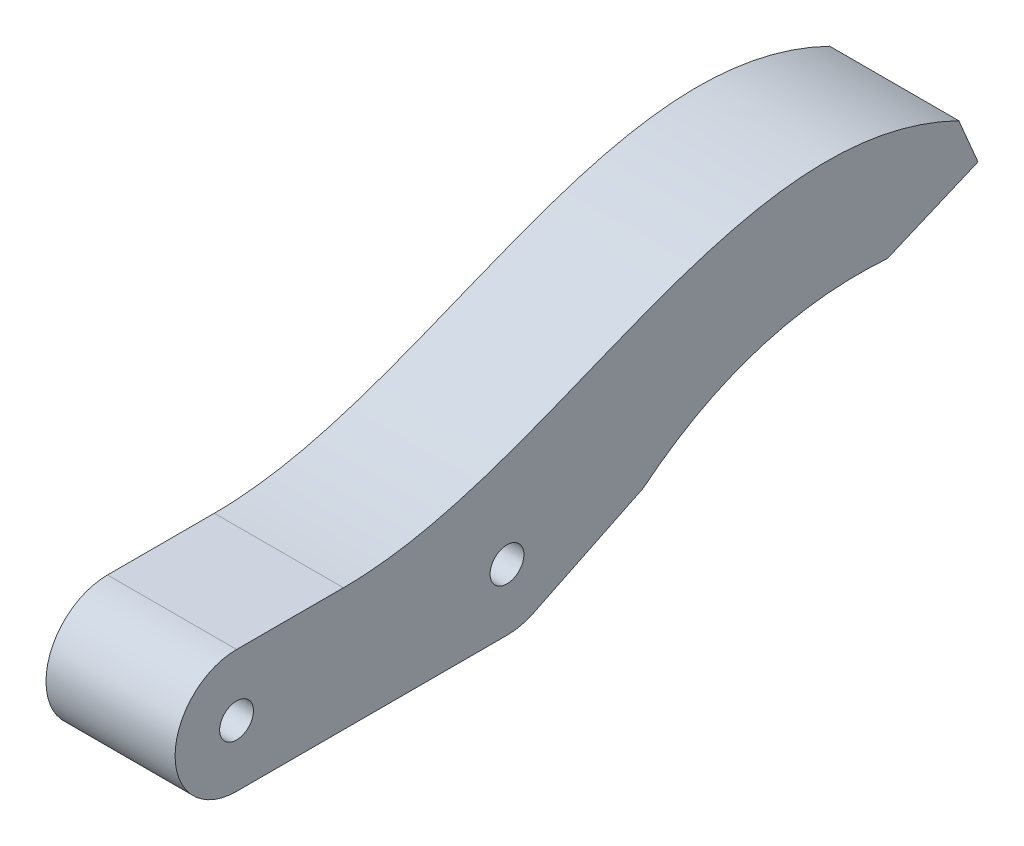
ISO-10303-21;
HEADER;
FILE_DESCRIPTION(('STEP AP214'),'2;1');
FILE_NAME('part.step','',(''),(''),'','','');
FILE_SCHEMA(('AUTOMOTIVE_DESIGN { 1 0 10303 214 1 1 1 1 }'));
ENDSEC;
DATA;
#1=APPLICATION_CONTEXT('core data for automotive mechanical design processes');
#2=APPLICATION_PROTOCOL_DEFINITION('international standard','automotive_design',2000,#1);
#3=PRODUCT_CONTEXT('',#1,'mechanical');
#4=PRODUCT('Part','Part','',(#3));
#5=PRODUCT_RELATED_PRODUCT_CATEGORY('part','',(#4));
#6=PRODUCT_DEFINITION_FORMATION('','',#4);
#7=PRODUCT_DEFINITION_CONTEXT('part definition',#1,'design');
#8=PRODUCT_DEFINITION('design','',#6,#7);
#9=PRODUCT_DEFINITION_SHAPE('','',#8);
#10=(LENGTH_UNIT() NAMED_UNIT(*) SI_UNIT(.MILLI.,.METRE.));
#11=(NAMED_UNIT(*) PLANE_ANGLE_UNIT() SI_UNIT($,.RADIAN.));
#12=(NAMED_UNIT(*) SI_UNIT($,.STERADIAN.) SOLID_ANGLE_UNIT());
#13=UNCERTAINTY_MEASURE_WITH_UNIT(LENGTH_MEASURE(1.E-05),#10,'distance_accuracy_value','');
#14=(GEOMETRIC_REPRESENTATION_CONTEXT(3) GLOBAL_UNCERTAINTY_ASSIGNED_CONTEXT((#13)) GLOBAL_UNIT_ASSIGNED_CONTEXT((#10,
#11,#12)) REPRESENTATION_CONTEXT('',''));
#15=CARTESIAN_POINT('',(0.,0.,0.));
#16=DIRECTION('',(0.,0.,1.));
#17=DIRECTION('',(1.,0.,0.));
#18=AXIS2_PLACEMENT_3D('',#15,#16,#17);
#19=CARTESIAN_POINT('',(10.5,5.,-27.));
#20=DIRECTION('',(-1.,0.,0.));
#21=DIRECTION('',(0.,0.,1.));
#22=AXIS2_PLACEMENT_3D('',#19,#20,#21);
#23=CYLINDRICAL_SURFACE('',#22,5.);
#24=DIRECTION('',(1.,0.,0.));
#25=VECTOR('',#24,1.);
#26=CARTESIAN_POINT('',(-56.0007840593189,0.502127655445501,-29.1838370754458));
#27=LINE('',#26,#25);
#28=CARTESIAN_POINT('',(0.,0.502127655445501,-29.1838370754458));
#29=VERTEX_POINT('',#28);
#30=CARTESIAN_POINT('',(10.5,0.502127655445501,-29.1838370754458));
#31=VERTEX_POINT('',#30);
#32=EDGE_CURVE('E188',#29,#31,#27,.T.);
#33=ORIENTED_EDGE('',*,*,#32,.T.);
#34=CARTESIAN_POINT('',(10.5,5.,-27.));
#35=DIRECTION('',(1.,0.,0.));
#36=DIRECTION('',(0.,0.,-1.));
#37=AXIS2_PLACEMENT_3D('',#34,#35,#36);
#38=CIRCLE('',#37,5.);
#39=CARTESIAN_POINT('',(10.5,0.,-27.));
#40=VERTEX_POINT('',#39);
#41=EDGE_CURVE('E205',#40,#31,#38,.T.);
#42=ORIENTED_EDGE('',*,*,#41,.F.);
#43=DIRECTION('',(-1.,0.,0.));
#44=VECTOR('',#43,1.);
#45=CARTESIAN_POINT('',(10.5,0.,-27.));
#46=LINE('',#45,#44);
#47=CARTESIAN_POINT('',(0.,0.,-27.));
#48=VERTEX_POINT('',#47);
#49=EDGE_CURVE('E208',#40,#48,#46,.T.);
#50=ORIENTED_EDGE('',*,*,#49,.T.);
#51=CARTESIAN_POINT('',(0.,5.,-27.));
#52=DIRECTION('',(1.,0.,0.));
#53=DIRECTION('',(0.,0.,-1.));
#54=AXIS2_PLACEMENT_3D('',#51,#52,#53);
#55=CIRCLE('',#54,5.);
#56=EDGE_CURVE('E75',#48,#29,#55,.T.);
#57=ORIENTED_EDGE('',*,*,#56,.T.);
#58=EDGE_LOOP('',(#33,#42,#50,#57));
#59=FACE_BOUND('',#58,.T.);
#60=ADVANCED_FACE('F60',(#59),#23,.T.);
#61=CARTESIAN_POINT('',(10.5,5.,-5.));
#62=DIRECTION('',(-1.,0.,0.));
#63=DIRECTION('',(0.,0.,1.));
#64=AXIS2_PLACEMENT_3D('',#61,#62,#63);
#65=CYLINDRICAL_SURFACE('',#64,5.);
#66=CARTESIAN_POINT('',(0.,5.,-5.));
#67=DIRECTION('',(1.,0.,0.));
#68=DIRECTION('',(0.,0.,-1.));
#69=AXIS2_PLACEMENT_3D('',#66,#67,#68);
#70=CIRCLE('',#69,5.);
#71=CARTESIAN_POINT('',(0.,10.,-5.));
#72=VERTEX_POINT('',#71);
#73=CARTESIAN_POINT('',(0.,0.,-5.));
#74=VERTEX_POINT('',#73);
#75=EDGE_CURVE('E210',#72,#74,#70,.T.);
#76=ORIENTED_EDGE('',*,*,#75,.T.);
#77=DIRECTION('',(-1.,0.,0.));
#78=VECTOR('',#77,1.);
#79=CARTESIAN_POINT('',(10.5,0.,-5.));
#80=LINE('',#79,#78);
#81=CARTESIAN_POINT('',(10.5,0.,-5.));
#82=VERTEX_POINT('',#81);
#83=EDGE_CURVE('E68',#82,#74,#80,.T.);
#84=ORIENTED_EDGE('',*,*,#83,.F.);
#85=CARTESIAN_POINT('',(10.5,5.,-5.));
#86=DIRECTION('',(1.,0.,0.));
#87=DIRECTION('',(0.,0.,-1.));
#88=AXIS2_PLACEMENT_3D('',#85,#86,#87);
#89=CIRCLE('',#88,5.);
#90=CARTESIAN_POINT('',(10.5,10.,-5.));
#91=VERTEX_POINT('',#90);
#92=EDGE_CURVE('E201',#91,#82,#89,.T.);
#93=ORIENTED_EDGE('',*,*,#92,.F.);
#94=DIRECTION('',(-1.,0.,0.));
#95=VECTOR('',#94,1.);
#96=CARTESIAN_POINT('',(10.5,10.,-5.));
#97=LINE('',#96,#95);
#98=EDGE_CURVE('E12',#91,#72,#97,.T.);
#99=ORIENTED_EDGE('',*,*,#98,.T.);
#100=EDGE_LOOP('',(#76,#84,#93,#99));
#101=FACE_BOUND('',#100,.T.);
#102=ADVANCED_FACE('F237',(#101),#65,.T.);
#103=CARTESIAN_POINT('',(10.5,0.,0.));
#104=DIRECTION('',(0.,1.,0.));
#105=DIRECTION('',(0.,0.,1.));
#106=AXIS2_PLACEMENT_3D('',#103,#104,#105);
#107=PLANE('',#106);
#108=DIRECTION('',(0.,0.,-1.));
#109=VECTOR('',#108,1.);
#110=CARTESIAN_POINT('',(0.,0.,0.));
#111=LINE('',#110,#109);
#112=EDGE_CURVE('E212',#74,#48,#111,.T.);
#113=ORIENTED_EDGE('',*,*,#112,.T.);
#114=ORIENTED_EDGE('',*,*,#49,.F.);
#115=DIRECTION('',(0.,0.,-1.));
#116=VECTOR('',#115,1.);
#117=CARTESIAN_POINT('',(10.5,0.,0.));
#118=LINE('',#117,#116);
#119=EDGE_CURVE('E203',#82,#40,#118,.T.);
#120=ORIENTED_EDGE('',*,*,#119,.F.);
#121=ORIENTED_EDGE('',*,*,#83,.T.);
#122=EDGE_LOOP('',(#113,#114,#120,#121));
#123=FACE_BOUND('',#122,.T.);
#124=ADVANCED_FACE('F220',(#123),#107,.F.);
#125=CARTESIAN_POINT('',(10.5,10.,0.));
#126=DIRECTION('',(0.,1.,0.));
#127=DIRECTION('',(0.,0.,1.));
#128=AXIS2_PLACEMENT_3D('',#125,#126,#127);
#129=PLANE('',#128);
#130=DIRECTION('',(1.,0.,0.));
#131=VECTOR('',#130,1.);
#132=CARTESIAN_POINT('',(-56.0007840593189,10.,-13.6949747586838));
#133=LINE('',#132,#131);
#134=CARTESIAN_POINT('',(0.,10.,-13.6949747586838));
#135=VERTEX_POINT('',#134);
#136=CARTESIAN_POINT('',(10.5,10.,-13.6949747586838));
#137=VERTEX_POINT('',#136);
#138=EDGE_CURVE('E83',#135,#137,#133,.T.);
#139=ORIENTED_EDGE('',*,*,#138,.F.);
#140=DIRECTION('',(0.,0.,-1.));
#141=VECTOR('',#140,1.);
#142=CARTESIAN_POINT('',(0.,10.,0.));
#143=LINE('',#142,#141);
#144=EDGE_CURVE('E195',#72,#135,#143,.T.);
#145=ORIENTED_EDGE('',*,*,#144,.F.);
#146=ORIENTED_EDGE('',*,*,#98,.F.);
#147=DIRECTION('',(0.,0.,-1.));
#148=VECTOR('',#147,1.);
#149=CARTESIAN_POINT('',(10.5,10.,0.));
#150=LINE('',#149,#148);
#151=EDGE_CURVE('E196',#91,#137,#150,.T.);
#152=ORIENTED_EDGE('',*,*,#151,.T.);
#153=EDGE_LOOP('',(#139,#145,#146,#152));
#154=FACE_BOUND('',#153,.T.);
#155=ADVANCED_FACE('F62',(#154),#129,.T.);
#156=CARTESIAN_POINT('',(0.,0.,0.));
#157=DIRECTION('',(1.,0.,0.));
#158=DIRECTION('',(0.,0.,-1.));
#159=AXIS2_PLACEMENT_3D('',#156,#157,#158);
#160=PLANE('',#159);
#161=CARTESIAN_POINT('',(0.,5.,-27.));
#162=DIRECTION('',(1.,0.,0.));
#163=DIRECTION('',(0.,0.,-1.));
#164=AXIS2_PLACEMENT_3D('',#161,#162,#163);
#165=CIRCLE('',#164,1.375);
#166=CARTESIAN_POINT('',(0.,5.,-28.375));
#167=VERTEX_POINT('',#166);
#168=EDGE_CURVE('E155',#167,#167,#165,.T.);
#169=ORIENTED_EDGE('',*,*,#168,.T.);
#170=EDGE_LOOP('',(#169));
#171=FACE_BOUND('',#170,.T.);
#172=CARTESIAN_POINT('',(0.,5.,-5.));
#173=DIRECTION('',(1.,0.,0.));
#174=DIRECTION('',(0.,0.,-1.));
#175=AXIS2_PLACEMENT_3D('',#172,#173,#174);
#176=CIRCLE('',#175,1.375);
#177=CARTESIAN_POINT('',(0.,5.,-6.375));
#178=VERTEX_POINT('',#177);
#179=EDGE_CURVE('E366',#178,#178,#176,.T.);
#180=ORIENTED_EDGE('',*,*,#179,.T.);
#181=EDGE_LOOP('',(#180));
#182=FACE_BOUND('',#181,.T.);
#183=DIRECTION('',(0.,-0.436767415089167,0.8995744689109));
#184=VECTOR('',#183,1.);
#185=CARTESIAN_POINT('',(0.,-11.0601312365663,-5.36998891997289));
#186=LINE('',#185,#184);
#187=CARTESIAN_POINT('',(0.,4.82408407678908,-38.0854206599091));
#188=VERTEX_POINT('',#187);
#189=EDGE_CURVE('E183',#188,#29,#186,.T.);
#190=ORIENTED_EDGE('',*,*,#189,.T.);
#191=ORIENTED_EDGE('',*,*,#56,.F.);
#192=ORIENTED_EDGE('',*,*,#112,.F.);
#193=ORIENTED_EDGE('',*,*,#75,.F.);
#194=ORIENTED_EDGE('',*,*,#144,.T.);
#195=CARTESIAN_POINT('',(0.,17.8724231173908,-63.7529722863132));
#196=CARTESIAN_POINT('',(0.,26.563787962677,-45.9288826779558));
#197=CARTESIAN_POINT('',(0.,10.,-31.059268620705));
#198=CARTESIAN_POINT('',(0.,10.,-13.6949747586838));
#199=B_SPLINE_CURVE_WITH_KNOTS('',3,(#195,#196,#197,#198),.UNSPECIFIED.,.F.,.F.,(4,4),(0.,1.),.UNSPECIFIED.);
#200=CARTESIAN_POINT('',(0.,17.8724231173908,-63.7529722863132));
#201=VERTEX_POINT('',#200);
#202=EDGE_CURVE('E191',#135,#201,#199,.F.);
#203=ORIENTED_EDGE('',*,*,#202,.T.);
#204=DIRECTION('',(0.,-0.920726160293631,-0.39020935118337));
#205=VECTOR('',#204,1.);
#206=CARTESIAN_POINT('',(0.,25.6262249672031,-60.4668638650484));
#207=LINE('',#206,#205);
#208=CARTESIAN_POINT('',(0.,14.1895184762162,-65.3138096910467));
#209=VERTEX_POINT('',#208);
#210=EDGE_CURVE('E140',#201,#209,#207,.T.);
#211=ORIENTED_EDGE('',*,*,#210,.T.);
#212=DIRECTION('',(0.,-0.39020935118337,0.920726160293631));
#213=VECTOR('',#212,1.);
#214=CARTESIAN_POINT('',(0.,-11.4367064909869,-4.84694582599828));
#215=LINE('',#214,#213);
#216=CARTESIAN_POINT('',(0.,11.0678436667493,-57.9480004086976));
#217=VERTEX_POINT('',#216);
#218=EDGE_CURVE('E239',#209,#217,#215,.T.);
#219=ORIENTED_EDGE('',*,*,#218,.T.);
#220=CARTESIAN_POINT('',(0.,4.82408407678908,-38.0854206599091));
#221=CARTESIAN_POINT('',(0.,11.8952224566425,-46.7975095094647));
#222=CARTESIAN_POINT('',(0.,11.0678436667493,-57.9480004086976));
#223=B_SPLINE_CURVE_WITH_KNOTS('',2,(#220,#221,#222),.UNSPECIFIED.,.F.,.F.,(3,3),(0.,1.),.UNSPECIFIED.);
#224=EDGE_CURVE('E230',#217,#188,#223,.F.);
#225=ORIENTED_EDGE('',*,*,#224,.T.);
#226=EDGE_LOOP('',(#190,#191,#192,#193,#194,#203,#211,#219,#225));
#227=FACE_BOUND('',#226,.T.);
#228=ADVANCED_FACE('F226',(#171,#182,#227),#160,.F.);
#229=CARTESIAN_POINT('',(10.5,0.,0.));
#230=DIRECTION('',(1.,0.,0.));
#231=DIRECTION('',(0.,0.,-1.));
#232=AXIS2_PLACEMENT_3D('',#229,#230,#231);
#233=PLANE('',#232);
#234=CARTESIAN_POINT('',(10.5,5.,-27.));
#235=DIRECTION('',(1.,0.,0.));
#236=DIRECTION('',(0.,0.,-1.));
#237=AXIS2_PLACEMENT_3D('',#234,#235,#236);
#238=CIRCLE('',#237,1.375);
#239=CARTESIAN_POINT('',(10.5,5.,-28.375));
#240=VERTEX_POINT('',#239);
#241=EDGE_CURVE('E158',#240,#240,#238,.T.);
#242=ORIENTED_EDGE('',*,*,#241,.F.);
#243=EDGE_LOOP('',(#242));
#244=FACE_BOUND('',#243,.T.);
#245=CARTESIAN_POINT('',(10.5,5.,-5.));
#246=DIRECTION('',(1.,0.,0.));
#247=DIRECTION('',(0.,0.,-1.));
#248=AXIS2_PLACEMENT_3D('',#245,#246,#247);
#249=CIRCLE('',#248,1.375);
#250=CARTESIAN_POINT('',(10.5,5.,-6.375));
#251=VERTEX_POINT('',#250);
#252=EDGE_CURVE('E363',#251,#251,#249,.T.);
#253=ORIENTED_EDGE('',*,*,#252,.F.);
#254=EDGE_LOOP('',(#253));
#255=FACE_BOUND('',#254,.T.);
#256=ORIENTED_EDGE('',*,*,#151,.F.);
#257=ORIENTED_EDGE('',*,*,#92,.T.);
#258=ORIENTED_EDGE('',*,*,#119,.T.);
#259=ORIENTED_EDGE('',*,*,#41,.T.);
#260=DIRECTION('',(0.,0.436767415089167,-0.8995744689109));
#261=VECTOR('',#260,1.);
#262=CARTESIAN_POINT('',(10.5,-11.0601312365663,-5.36998891997289));
#263=LINE('',#262,#261);
#264=CARTESIAN_POINT('',(10.5,4.82408407678908,-38.0854206599091));
#265=VERTEX_POINT('',#264);
#266=EDGE_CURVE('E150',#31,#265,#263,.T.);
#267=ORIENTED_EDGE('',*,*,#266,.T.);
#268=CARTESIAN_POINT('',(10.5,4.82408407678908,-38.0854206599091));
#269=CARTESIAN_POINT('',(10.5,11.8952224566425,-46.7975095094647));
#270=CARTESIAN_POINT('',(10.5,11.0678436667493,-57.9480004086976));
#271=B_SPLINE_CURVE_WITH_KNOTS('',2,(#268,#269,#270),.UNSPECIFIED.,.F.,.F.,(3,3),(0.,1.),.UNSPECIFIED.);
#272=CARTESIAN_POINT('',(10.5,11.0678436667493,-57.9480004086976));
#273=VERTEX_POINT('',#272);
#274=EDGE_CURVE('E173',#265,#273,#271,.T.);
#275=ORIENTED_EDGE('',*,*,#274,.T.);
#276=DIRECTION('',(0.,0.39020935118337,-0.920726160293631));
#277=VECTOR('',#276,1.);
#278=CARTESIAN_POINT('',(10.5,-11.4367064909869,-4.84694582599828));
#279=LINE('',#278,#277);
#280=CARTESIAN_POINT('',(10.5,14.1895184762162,-65.3138096910467));
#281=VERTEX_POINT('',#280);
#282=EDGE_CURVE('E143',#273,#281,#279,.T.);
#283=ORIENTED_EDGE('',*,*,#282,.T.);
#284=DIRECTION('',(0.,0.920726160293631,0.39020935118337));
#285=VECTOR('',#284,1.);
#286=CARTESIAN_POINT('',(10.5,25.6262249672031,-60.4668638650484));
#287=LINE('',#286,#285);
#288=CARTESIAN_POINT('',(10.5,17.8724231173908,-63.7529722863132));
#289=VERTEX_POINT('',#288);
#290=EDGE_CURVE('E138',#281,#289,#287,.T.);
#291=ORIENTED_EDGE('',*,*,#290,.T.);
#292=CARTESIAN_POINT('',(10.5,17.8724231173908,-63.7529722863132));
#293=CARTESIAN_POINT('',(10.5,26.563787962677,-45.9288826779558));
#294=CARTESIAN_POINT('',(10.5,10.,-31.059268620705));
#295=CARTESIAN_POINT('',(10.5,10.,-13.6949747586838));
#296=B_SPLINE_CURVE_WITH_KNOTS('',3,(#292,#293,#294,#295),.UNSPECIFIED.,.F.,.F.,(4,4),(0.,1.),.UNSPECIFIED.);
#297=EDGE_CURVE('E146',#289,#137,#296,.T.);
#298=ORIENTED_EDGE('',*,*,#297,.T.);
#299=EDGE_LOOP('',(#256,#257,#258,#259,#267,#275,#283,#291,#298));
#300=FACE_BOUND('',#299,.T.);
#301=ADVANCED_FACE('F152',(#244,#255,#300),#233,.T.);
#302=CARTESIAN_POINT('',(-56.0007840593189,25.6262249672031,-60.4668638650484));
#303=DIRECTION('',(0.,0.39020935118337,-0.920726160293632));
#304=DIRECTION('',(0.,0.920726160293631,0.39020935118337));
#305=AXIS2_PLACEMENT_3D('',#302,#303,#304);
#306=PLANE('',#305);
#307=ORIENTED_EDGE('',*,*,#210,.F.);
#308=DIRECTION('',(1.,0.,0.));
#309=VECTOR('',#308,1.);
#310=CARTESIAN_POINT('',(-56.0007840593189,17.8724231173908,-63.7529722863132));
#311=LINE('',#310,#309);
#312=EDGE_CURVE('E133',#201,#289,#311,.T.);
#313=ORIENTED_EDGE('',*,*,#312,.T.);
#314=ORIENTED_EDGE('',*,*,#290,.F.);
#315=DIRECTION('',(1.,0.,0.));
#316=VECTOR('',#315,1.);
#317=CARTESIAN_POINT('',(-56.0007840593189,14.1895184762162,-65.3138096910467));
#318=LINE('',#317,#316);
#319=EDGE_CURVE('E181',#209,#281,#318,.T.);
#320=ORIENTED_EDGE('',*,*,#319,.F.);
#321=EDGE_LOOP('',(#307,#313,#314,#320));
#322=FACE_BOUND('',#321,.T.);
#323=ADVANCED_FACE('F135',(#322),#306,.T.);
#324=CARTESIAN_POINT('',(-56.0007840593189,-11.4367064909869,-4.84694582599828));
#325=DIRECTION('',(0.,-0.920726160293631,-0.39020935118337));
#326=DIRECTION('',(0.,0.39020935118337,-0.920726160293631));
#327=AXIS2_PLACEMENT_3D('',#324,#325,#326);
#328=PLANE('',#327);
#329=ORIENTED_EDGE('',*,*,#218,.F.);
#330=ORIENTED_EDGE('',*,*,#319,.T.);
#331=ORIENTED_EDGE('',*,*,#282,.F.);
#332=DIRECTION('',(1.,0.,0.));
#333=VECTOR('',#332,1.);
#334=CARTESIAN_POINT('',(-56.0007840593189,11.0678436667493,-57.9480004086976));
#335=LINE('',#334,#333);
#336=EDGE_CURVE('E184',#217,#273,#335,.T.);
#337=ORIENTED_EDGE('',*,*,#336,.F.);
#338=EDGE_LOOP('',(#329,#330,#331,#337));
#339=FACE_BOUND('',#338,.T.);
#340=ADVANCED_FACE('F243',(#339),#328,.T.);
#341=CARTESIAN_POINT('',(-56.0007840593189,4.82408407678908,-38.0854206599091));
#342=CARTESIAN_POINT('',(-56.0007840593189,11.8952224566425,-46.7975095094647));
#343=CARTESIAN_POINT('',(-56.0007840593189,11.0678436667493,-57.9480004086976));
#344=B_SPLINE_CURVE_WITH_KNOTS('',2,(#341,#342,#343),.UNSPECIFIED.,.F.,.F.,(3,3),(0.,1.),.UNSPECIFIED.);
#345=DIRECTION('',(1.,0.,0.));
#346=VECTOR('',#345,1.);
#347=SURFACE_OF_LINEAR_EXTRUSION('',#344,#346);
#348=ORIENTED_EDGE('',*,*,#224,.F.);
#349=ORIENTED_EDGE('',*,*,#336,.T.);
#350=ORIENTED_EDGE('',*,*,#274,.F.);
#351=DIRECTION('',(1.,0.,0.));
#352=VECTOR('',#351,1.);
#353=CARTESIAN_POINT('',(-56.0007840593189,4.82408407678908,-38.0854206599091));
#354=LINE('',#353,#352);
#355=EDGE_CURVE('E186',#188,#265,#354,.T.);
#356=ORIENTED_EDGE('',*,*,#355,.F.);
#357=EDGE_LOOP('',(#348,#349,#350,#356));
#358=FACE_BOUND('',#357,.T.);
#359=ADVANCED_FACE('F304',(#358),#347,.T.);
#360=CARTESIAN_POINT('',(-56.0007840593189,-11.0601312365663,-5.36998891997289));
#361=DIRECTION('',(0.,-0.8995744689109,-0.436767415089167));
#362=DIRECTION('',(0.,0.436767415089167,-0.8995744689109));
#363=AXIS2_PLACEMENT_3D('',#360,#361,#362);
#364=PLANE('',#363);
#365=ORIENTED_EDGE('',*,*,#189,.F.);
#366=ORIENTED_EDGE('',*,*,#355,.T.);
#367=ORIENTED_EDGE('',*,*,#266,.F.);
#368=ORIENTED_EDGE('',*,*,#32,.F.);
#369=EDGE_LOOP('',(#365,#366,#367,#368));
#370=FACE_BOUND('',#369,.T.);
#371=ADVANCED_FACE('F235',(#370),#364,.T.);
#372=CARTESIAN_POINT('',(-56.0007840593189,17.8724231173908,-63.7529722863132));
#373=CARTESIAN_POINT('',(-56.0007840593189,26.563787962677,-45.9288826779558));
#374=CARTESIAN_POINT('',(-56.0007840593189,10.,-31.059268620705));
#375=CARTESIAN_POINT('',(-56.0007840593189,10.,-13.6949747586838));
#376=B_SPLINE_CURVE_WITH_KNOTS('',3,(#372,#373,#374,#375),.UNSPECIFIED.,.F.,.F.,(4,4),(0.,1.),.UNSPECIFIED.);
#377=DIRECTION('',(1.,0.,0.));
#378=VECTOR('',#377,1.);
#379=SURFACE_OF_LINEAR_EXTRUSION('',#376,#378);
#380=ORIENTED_EDGE('',*,*,#202,.F.);
#381=ORIENTED_EDGE('',*,*,#138,.T.);
#382=ORIENTED_EDGE('',*,*,#297,.F.);
#383=ORIENTED_EDGE('',*,*,#312,.F.);
#384=EDGE_LOOP('',(#380,#381,#382,#383));
#385=FACE_BOUND('',#384,.T.);
#386=ADVANCED_FACE('F147',(#385),#379,.T.);
#387=CARTESIAN_POINT('',(0.,5.,-5.));
#388=DIRECTION('',(1.,0.,0.));
#389=DIRECTION('',(0.,0.,-1.));
#390=AXIS2_PLACEMENT_3D('',#387,#388,#389);
#391=CYLINDRICAL_SURFACE('',#390,1.375);
#392=CARTESIAN_POINT('',(0.,5.,-6.375));
#393=CARTESIAN_POINT('',(0.109375,5.,-6.375));
#394=CARTESIAN_POINT('',(0.21875,5.,-6.375));
#395=CARTESIAN_POINT('',(0.4375,5.,-6.375));
#396=CARTESIAN_POINT('',(0.546875,5.,-6.375));
#397=CARTESIAN_POINT('',(0.765625,5.,-6.375));
#398=CARTESIAN_POINT('',(0.875,5.,-6.375));
#399=CARTESIAN_POINT('',(1.09375,5.,-6.375));
#400=CARTESIAN_POINT('',(1.203125,5.,-6.375));
#401=CARTESIAN_POINT('',(1.421875,5.,-6.375));
#402=CARTESIAN_POINT('',(1.53125,5.,-6.375));
#403=CARTESIAN_POINT('',(1.75,5.,-6.375));
#404=CARTESIAN_POINT('',(1.859375,5.,-6.375));
#405=CARTESIAN_POINT('',(2.078125,5.,-6.375));
#406=CARTESIAN_POINT('',(2.1875,5.,-6.375));
#407=CARTESIAN_POINT('',(2.40625,5.,-6.375));
#408=CARTESIAN_POINT('',(2.515625,5.,-6.375));
#409=CARTESIAN_POINT('',(2.734375,5.,-6.375));
#410=CARTESIAN_POINT('',(2.84375,5.,-6.375));
#411=CARTESIAN_POINT('',(3.0625,5.,-6.375));
#412=CARTESIAN_POINT('',(3.171875,5.,-6.375));
#413=CARTESIAN_POINT('',(3.390625,5.,-6.375));
#414=CARTESIAN_POINT('',(3.5,5.,-6.375));
#415=CARTESIAN_POINT('',(3.71875,5.,-6.375));
#416=CARTESIAN_POINT('',(3.828125,5.,-6.375));
#417=CARTESIAN_POINT('',(4.046875,5.,-6.375));
#418=CARTESIAN_POINT('',(4.15625,5.,-6.375));
#419=CARTESIAN_POINT('',(4.375,5.,-6.375));
#420=CARTESIAN_POINT('',(4.484375,5.,-6.375));
#421=CARTESIAN_POINT('',(4.703125,5.,-6.375));
#422=CARTESIAN_POINT('',(4.8125,5.,-6.375));
#423=CARTESIAN_POINT('',(5.03125,5.,-6.375));
#424=CARTESIAN_POINT('',(5.140625,5.,-6.375));
#425=CARTESIAN_POINT('',(5.359375,5.,-6.375));
#426=CARTESIAN_POINT('',(5.46875,5.,-6.375));
#427=CARTESIAN_POINT('',(5.6875,5.,-6.375));
#428=CARTESIAN_POINT('',(5.796875,5.,-6.375));
#429=CARTESIAN_POINT('',(6.015625,5.,-6.375));
#430=CARTESIAN_POINT('',(6.125,5.,-6.375));
#431=CARTESIAN_POINT('',(6.34375,5.,-6.375));
#432=CARTESIAN_POINT('',(6.453125,5.,-6.375));
#433=CARTESIAN_POINT('',(6.671875,5.,-6.375));
#434=CARTESIAN_POINT('',(6.78125,5.,-6.375));
#435=CARTESIAN_POINT('',(7.,5.,-6.375));
#436=CARTESIAN_POINT('',(7.109375,5.,-6.375));
#437=CARTESIAN_POINT('',(7.328125,5.,-6.375));
#438=CARTESIAN_POINT('',(7.4375,5.,-6.375));
#439=CARTESIAN_POINT('',(7.65625,5.,-6.375));
#440=CARTESIAN_POINT('',(7.765625,5.,-6.375));
#441=CARTESIAN_POINT('',(7.984375,5.,-6.375));
#442=CARTESIAN_POINT('',(8.09375,5.,-6.375));
#443=CARTESIAN_POINT('',(8.3125,5.,-6.375));
#444=CARTESIAN_POINT('',(8.421875,5.,-6.375));
#445=CARTESIAN_POINT('',(8.640625,5.,-6.375));
#446=CARTESIAN_POINT('',(8.75,5.,-6.375));
#447=CARTESIAN_POINT('',(8.96875,5.,-6.375));
#448=CARTESIAN_POINT('',(9.078125,5.,-6.375));
#449=CARTESIAN_POINT('',(9.296875,5.,-6.375));
#450=CARTESIAN_POINT('',(9.40625,5.,-6.375));
#451=CARTESIAN_POINT('',(9.625,5.,-6.375));
#452=CARTESIAN_POINT('',(9.734375,5.,-6.375));
#453=CARTESIAN_POINT('',(9.953125,5.,-6.375));
#454=CARTESIAN_POINT('',(10.0625,5.,-6.375));
#455=CARTESIAN_POINT('',(10.28125,5.,-6.375));
#456=CARTESIAN_POINT('',(10.390625,5.,-6.375));
#457=CARTESIAN_POINT('',(10.5,5.,-6.375));
#458=B_SPLINE_CURVE_WITH_KNOTS('',3,(#392,#393,#394,#395,#396,#397,#398,#399,#400,#401,#402,
#403,#404,#405,#406,#407,#408,#409,#410,#411,#412,#413,#414,#415,#416,#417,#418,#419,#420,#421,
#422,#423,#424,#425,#426,#427,#428,#429,#430,#431,#432,#433,#434,#435,#436,#437,#438,#439,#440,
#441,#442,#443,#444,#445,#446,#447,#448,#449,#450,#451,#452,#453,#454,#455,#456,#457),
.UNSPECIFIED.,.F.,.F.,(4,2,2,2,2,2,2,2,2,2,2,2,2,2,2,2,2,2,2,2,2,2,2,2,2,2,2,2,2,2,2,2,4),(0.,
0.328125,0.65625,0.984375,1.3125,1.640625,1.96875,2.296875,2.625,2.953125,3.28125,3.609375,
3.9375,4.265625,4.59375,4.921875,5.25,5.578125,5.90625,6.234375,6.5625,6.890625,7.21875,
7.546875,7.875,8.203125,8.53125,8.859375,9.1875,9.515625,9.84375,10.171875,10.5),.UNSPECIFIED.);
#459=EDGE_CURVE('BSEAM258',#178,#251,#458,.T.);
#460=ORIENTED_EDGE('',*,*,#179,.F.);
#461=ORIENTED_EDGE('',*,*,#252,.T.);
#462=ORIENTED_EDGE('',*,*,#459,.T.);
#463=ORIENTED_EDGE('',*,*,#459,.F.);
#464=EDGE_LOOP('',(#460,#462,#461,#463));
#465=FACE_BOUND('',#464,.T.);
#466=ADVANCED_FACE('F258',(#465),#391,.F.);
#467=CARTESIAN_POINT('',(0.,5.,-27.));
#468=DIRECTION('',(1.,0.,0.));
#469=DIRECTION('',(0.,0.,-1.));
#470=AXIS2_PLACEMENT_3D('',#467,#468,#469);
#471=CYLINDRICAL_SURFACE('',#470,1.375);
#472=CARTESIAN_POINT('',(0.,5.,-28.375));
#473=CARTESIAN_POINT('',(0.109375,5.,-28.375));
#474=CARTESIAN_POINT('',(0.21875,5.,-28.375));
#475=CARTESIAN_POINT('',(0.4375,5.,-28.375));
#476=CARTESIAN_POINT('',(0.546875,5.,-28.375));
#477=CARTESIAN_POINT('',(0.765625,5.,-28.375));
#478=CARTESIAN_POINT('',(0.875,5.,-28.375));
#479=CARTESIAN_POINT('',(1.09375,5.,-28.375));
#480=CARTESIAN_POINT('',(1.203125,5.,-28.375));
#481=CARTESIAN_POINT('',(1.421875,5.,-28.375));
#482=CARTESIAN_POINT('',(1.53125,5.,-28.375));
#483=CARTESIAN_POINT('',(1.75,5.,-28.375));
#484=CARTESIAN_POINT('',(1.859375,5.,-28.375));
#485=CARTESIAN_POINT('',(2.078125,5.,-28.375));
#486=CARTESIAN_POINT('',(2.1875,5.,-28.375));
#487=CARTESIAN_POINT('',(2.40625,5.,-28.375));
#488=CARTESIAN_POINT('',(2.515625,5.,-28.375));
#489=CARTESIAN_POINT('',(2.734375,5.,-28.375));
#490=CARTESIAN_POINT('',(2.84375,5.,-28.375));
#491=CARTESIAN_POINT('',(3.0625,5.,-28.375));
#492=CARTESIAN_POINT('',(3.171875,5.,-28.375));
#493=CARTESIAN_POINT('',(3.390625,5.,-28.375));
#494=CARTESIAN_POINT('',(3.5,5.,-28.375));
#495=CARTESIAN_POINT('',(3.71875,5.,-28.375));
#496=CARTESIAN_POINT('',(3.828125,5.,-28.375));
#497=CARTESIAN_POINT('',(4.046875,5.,-28.375));
#498=CARTESIAN_POINT('',(4.15625,5.,-28.375));
#499=CARTESIAN_POINT('',(4.375,5.,-28.375));
#500=CARTESIAN_POINT('',(4.484375,5.,-28.375));
#501=CARTESIAN_POINT('',(4.703125,5.,-28.375));
#502=CARTESIAN_POINT('',(4.8125,5.,-28.375));
#503=CARTESIAN_POINT('',(5.03125,5.,-28.375));
#504=CARTESIAN_POINT('',(5.140625,5.,-28.375));
#505=CARTESIAN_POINT('',(5.359375,5.,-28.375));
#506=CARTESIAN_POINT('',(5.46875,5.,-28.375));
#507=CARTESIAN_POINT('',(5.6875,5.,-28.375));
#508=CARTESIAN_POINT('',(5.796875,5.,-28.375));
#509=CARTESIAN_POINT('',(6.015625,5.,-28.375));
#510=CARTESIAN_POINT('',(6.125,5.,-28.375));
#511=CARTESIAN_POINT('',(6.34375,5.,-28.375));
#512=CARTESIAN_POINT('',(6.453125,5.,-28.375));
#513=CARTESIAN_POINT('',(6.671875,5.,-28.375));
#514=CARTESIAN_POINT('',(6.78125,5.,-28.375));
#515=CARTESIAN_POINT('',(7.,5.,-28.375));
#516=CARTESIAN_POINT('',(7.109375,5.,-28.375));
#517=CARTESIAN_POINT('',(7.328125,5.,-28.375));
#518=CARTESIAN_POINT('',(7.4375,5.,-28.375));
#519=CARTESIAN_POINT('',(7.65625,5.,-28.375));
#520=CARTESIAN_POINT('',(7.765625,5.,-28.375));
#521=CARTESIAN_POINT('',(7.984375,5.,-28.375));
#522=CARTESIAN_POINT('',(8.09375,5.,-28.375));
#523=CARTESIAN_POINT('',(8.3125,5.,-28.375));
#524=CARTESIAN_POINT('',(8.421875,5.,-28.375));
#525=CARTESIAN_POINT('',(8.640625,5.,-28.375));
#526=CARTESIAN_POINT('',(8.75,5.,-28.375));
#527=CARTESIAN_POINT('',(8.96875,5.,-28.375));
#528=CARTESIAN_POINT('',(9.078125,5.,-28.375));
#529=CARTESIAN_POINT('',(9.296875,5.,-28.375));
#530=CARTESIAN_POINT('',(9.40625,5.,-28.375));
#531=CARTESIAN_POINT('',(9.625,5.,-28.375));
#532=CARTESIAN_POINT('',(9.734375,5.,-28.375));
#533=CARTESIAN_POINT('',(9.953125,5.,-28.375));
#534=CARTESIAN_POINT('',(10.0625,5.,-28.375));
#535=CARTESIAN_POINT('',(10.28125,5.,-28.375));
#536=CARTESIAN_POINT('',(10.390625,5.,-28.375));
#537=CARTESIAN_POINT('',(10.5,5.,-28.375));
#538=B_SPLINE_CURVE_WITH_KNOTS('',3,(#472,#473,#474,#475,#476,#477,#478,#479,#480,#481,#482,
#483,#484,#485,#486,#487,#488,#489,#490,#491,#492,#493,#494,#495,#496,#497,#498,#499,#500,#501,
#502,#503,#504,#505,#506,#507,#508,#509,#510,#511,#512,#513,#514,#515,#516,#517,#518,#519,#520,
#521,#522,#523,#524,#525,#526,#527,#528,#529,#530,#531,#532,#533,#534,#535,#536,#537),
.UNSPECIFIED.,.F.,.F.,(4,2,2,2,2,2,2,2,2,2,2,2,2,2,2,2,2,2,2,2,2,2,2,2,2,2,2,2,2,2,2,2,4),(0.,
0.328125,0.65625,0.984375,1.3125,1.640625,1.96875,2.296875,2.625,2.953125,3.28125,3.609375,
3.9375,4.265625,4.59375,4.921875,5.25,5.578125,5.90625,6.234375,6.5625,6.890625,7.21875,
7.546875,7.875,8.203125,8.53125,8.859375,9.1875,9.515625,9.84375,10.171875,10.5),.UNSPECIFIED.);
#539=EDGE_CURVE('BSEAM339',#167,#240,#538,.T.);
#540=ORIENTED_EDGE('',*,*,#168,.F.);
#541=ORIENTED_EDGE('',*,*,#241,.T.);
#542=ORIENTED_EDGE('',*,*,#539,.T.);
#543=ORIENTED_EDGE('',*,*,#539,.F.);
#544=EDGE_LOOP('',(#540,#542,#541,#543));
#545=FACE_BOUND('',#544,.T.);
#546=ADVANCED_FACE('F339',(#545),#471,.F.);
#547=CLOSED_SHELL('',(#60,#102,#124,#155,#228,#301,#323,#340,#359,#371,#386,#466,#546));
#548=MANIFOLD_SOLID_BREP('B2',#547);
#549=ADVANCED_BREP_SHAPE_REPRESENTATION('',(#18,#548),#14);
#550=SHAPE_DEFINITION_REPRESENTATION(#9,#549);
ENDSEC;
END-ISO-10303-21;
